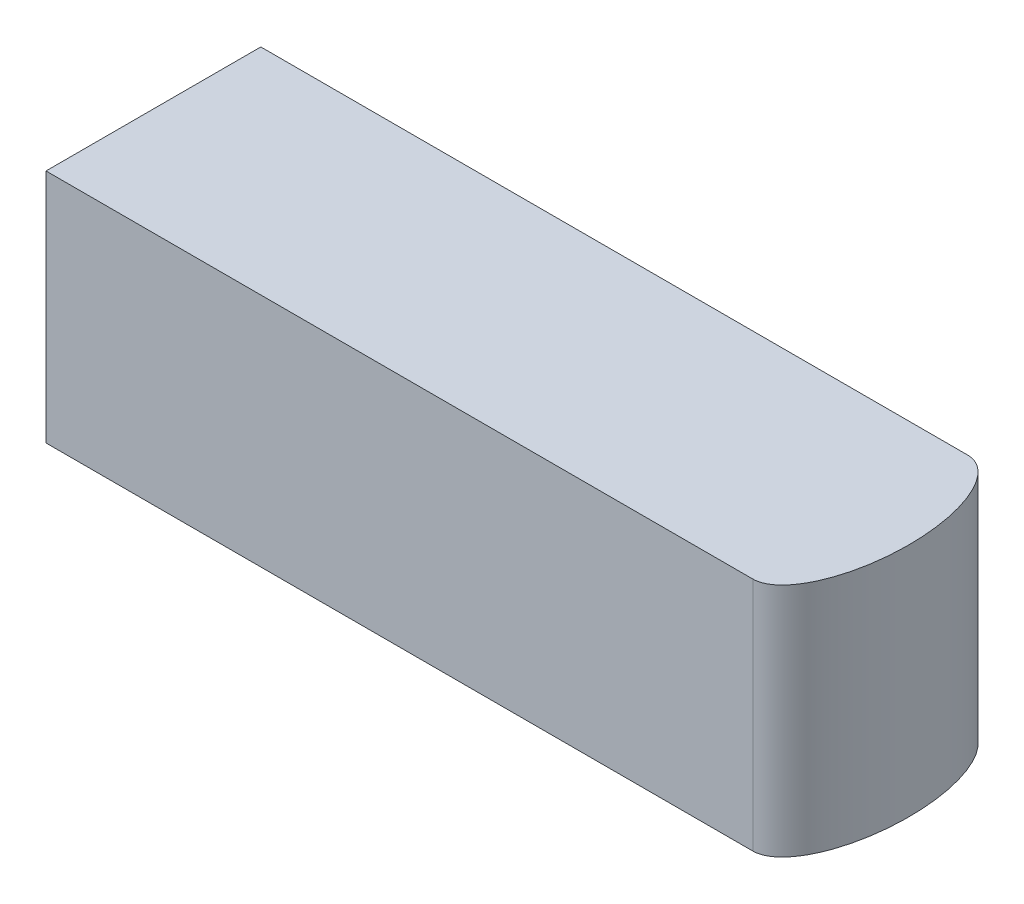
ISO-10303-21;
HEADER;
FILE_DESCRIPTION(('STEP AP214'),'2;1');
FILE_NAME('part.step','',(''),(''),'','','');
FILE_SCHEMA(('AUTOMOTIVE_DESIGN { 1 0 10303 214 1 1 1 1 }'));
ENDSEC;
DATA;
#1=APPLICATION_CONTEXT('core data for automotive mechanical design processes');
#2=APPLICATION_PROTOCOL_DEFINITION('international standard','automotive_design',2000,#1);
#3=PRODUCT_CONTEXT('',#1,'mechanical');
#4=PRODUCT('Part','Part','',(#3));
#5=PRODUCT_RELATED_PRODUCT_CATEGORY('part','',(#4));
#6=PRODUCT_DEFINITION_FORMATION('','',#4);
#7=PRODUCT_DEFINITION_CONTEXT('part definition',#1,'design');
#8=PRODUCT_DEFINITION('design','',#6,#7);
#9=PRODUCT_DEFINITION_SHAPE('','',#8);
#10=(LENGTH_UNIT() NAMED_UNIT(*) SI_UNIT(.MILLI.,.METRE.));
#11=(NAMED_UNIT(*) PLANE_ANGLE_UNIT() SI_UNIT($,.RADIAN.));
#12=(NAMED_UNIT(*) SI_UNIT($,.STERADIAN.) SOLID_ANGLE_UNIT());
#13=UNCERTAINTY_MEASURE_WITH_UNIT(LENGTH_MEASURE(1.E-05),#10,'distance_accuracy_value','');
#14=(GEOMETRIC_REPRESENTATION_CONTEXT(3) GLOBAL_UNCERTAINTY_ASSIGNED_CONTEXT((#13)) GLOBAL_UNIT_ASSIGNED_CONTEXT((#10,
#11,#12)) REPRESENTATION_CONTEXT('',''));
#15=CARTESIAN_POINT('',(0.,0.,0.));
#16=DIRECTION('',(0.,0.,1.));
#17=DIRECTION('',(1.,0.,0.));
#18=AXIS2_PLACEMENT_3D('',#15,#16,#17);
#19=CARTESIAN_POINT('',(51.,34.,0.));
#20=DIRECTION('',(0.,1.,0.));
#21=DIRECTION('',(0.,0.,-1.));
#22=AXIS2_PLACEMENT_3D('',#19,#20,#21);
#23=ELLIPSE('',#22,15.5,7.);
#24=DIRECTION('',(0.,-1.,0.));
#25=VECTOR('',#24,1.);
#26=SURFACE_OF_LINEAR_EXTRUSION('',#23,#25);
#27=CARTESIAN_POINT('',(51.,0.,0.));
#28=DIRECTION('',(0.,1.,0.));
#29=DIRECTION('',(0.,0.,-1.));
#30=AXIS2_PLACEMENT_3D('',#27,#28,#29);
#31=ELLIPSE('',#30,15.5,7.);
#32=CARTESIAN_POINT('',(51.,0.,15.5));
#33=VERTEX_POINT('',#32);
#34=CARTESIAN_POINT('',(51.,0.,-15.5));
#35=VERTEX_POINT('',#34);
#36=EDGE_CURVE('E99',#33,#35,#31,.T.);
#37=ORIENTED_EDGE('',*,*,#36,.T.);
#38=DIRECTION('',(0.,-1.,0.));
#39=VECTOR('',#38,1.);
#40=CARTESIAN_POINT('',(51.,34.,-15.5));
#41=LINE('',#40,#39);
#42=CARTESIAN_POINT('',(51.,34.,-15.5));
#43=VERTEX_POINT('',#42);
#44=EDGE_CURVE('E11',#43,#35,#41,.T.);
#45=ORIENTED_EDGE('',*,*,#44,.F.);
#46=CARTESIAN_POINT('',(51.,34.,15.5));
#47=VERTEX_POINT('',#46);
#48=EDGE_CURVE('E88',#47,#43,#23,.T.);
#49=ORIENTED_EDGE('',*,*,#48,.F.);
#50=DIRECTION('',(0.,-1.,0.));
#51=VECTOR('',#50,1.);
#52=CARTESIAN_POINT('',(51.,34.,15.5));
#53=LINE('',#52,#51);
#54=EDGE_CURVE('E96',#47,#33,#53,.T.);
#55=ORIENTED_EDGE('',*,*,#54,.T.);
#56=EDGE_LOOP('',(#37,#45,#49,#55));
#57=FACE_BOUND('',#56,.T.);
#58=ADVANCED_FACE('F36',(#57),#26,.F.);
#59=CARTESIAN_POINT('',(-51.,34.,-15.5));
#60=DIRECTION('',(0.,0.,1.));
#61=DIRECTION('',(1.,0.,0.));
#62=AXIS2_PLACEMENT_3D('',#59,#60,#61);
#63=PLANE('',#62);
#64=DIRECTION('',(-1.,0.,0.));
#65=VECTOR('',#64,1.);
#66=CARTESIAN_POINT('',(-51.,0.,-15.5));
#67=LINE('',#66,#65);
#68=CARTESIAN_POINT('',(-51.,0.,-15.5));
#69=VERTEX_POINT('',#68);
#70=EDGE_CURVE('E92',#35,#69,#67,.T.);
#71=ORIENTED_EDGE('',*,*,#70,.T.);
#72=DIRECTION('',(0.,-1.,0.));
#73=VECTOR('',#72,1.);
#74=CARTESIAN_POINT('',(-51.,34.,-15.5));
#75=LINE('',#74,#73);
#76=CARTESIAN_POINT('',(-51.,34.,-15.5));
#77=VERTEX_POINT('',#76);
#78=EDGE_CURVE('E45',#77,#69,#75,.T.);
#79=ORIENTED_EDGE('',*,*,#78,.F.);
#80=DIRECTION('',(-1.,0.,0.));
#81=VECTOR('',#80,1.);
#82=CARTESIAN_POINT('',(-51.,34.,-15.5));
#83=LINE('',#82,#81);
#84=EDGE_CURVE('E83',#43,#77,#83,.T.);
#85=ORIENTED_EDGE('',*,*,#84,.F.);
#86=ORIENTED_EDGE('',*,*,#44,.T.);
#87=EDGE_LOOP('',(#71,#79,#85,#86));
#88=FACE_BOUND('',#87,.T.);
#89=ADVANCED_FACE('F91',(#88),#63,.F.);
#90=CARTESIAN_POINT('',(-51.,34.,15.5));
#91=DIRECTION('',(1.,0.,0.));
#92=DIRECTION('',(0.,0.,-1.));
#93=AXIS2_PLACEMENT_3D('',#90,#91,#92);
#94=PLANE('',#93);
#95=DIRECTION('',(0.,0.,1.));
#96=VECTOR('',#95,1.);
#97=CARTESIAN_POINT('',(-51.,0.,15.5));
#98=LINE('',#97,#96);
#99=CARTESIAN_POINT('',(-51.,0.,15.5));
#100=VERTEX_POINT('',#99);
#101=EDGE_CURVE('E70',#69,#100,#98,.T.);
#102=ORIENTED_EDGE('',*,*,#101,.T.);
#103=DIRECTION('',(0.,-1.,0.));
#104=VECTOR('',#103,1.);
#105=CARTESIAN_POINT('',(-51.,34.,15.5));
#106=LINE('',#105,#104);
#107=CARTESIAN_POINT('',(-51.,34.,15.5));
#108=VERTEX_POINT('',#107);
#109=EDGE_CURVE('E93',#108,#100,#106,.T.);
#110=ORIENTED_EDGE('',*,*,#109,.F.);
#111=DIRECTION('',(0.,0.,1.));
#112=VECTOR('',#111,1.);
#113=CARTESIAN_POINT('',(-51.,34.,15.5));
#114=LINE('',#113,#112);
#115=EDGE_CURVE('E86',#77,#108,#114,.T.);
#116=ORIENTED_EDGE('',*,*,#115,.F.);
#117=ORIENTED_EDGE('',*,*,#78,.T.);
#118=EDGE_LOOP('',(#102,#110,#116,#117));
#119=FACE_BOUND('',#118,.T.);
#120=ADVANCED_FACE('F94',(#119),#94,.F.);
#121=CARTESIAN_POINT('',(-51.,34.,15.5));
#122=DIRECTION('',(0.,0.,-1.));
#123=DIRECTION('',(-1.,0.,0.));
#124=AXIS2_PLACEMENT_3D('',#121,#122,#123);
#125=PLANE('',#124);
#126=DIRECTION('',(1.,0.,0.));
#127=VECTOR('',#126,1.);
#128=CARTESIAN_POINT('',(-51.,0.,15.5));
#129=LINE('',#128,#127);
#130=EDGE_CURVE('E76',#100,#33,#129,.T.);
#131=ORIENTED_EDGE('',*,*,#130,.T.);
#132=ORIENTED_EDGE('',*,*,#54,.F.);
#133=DIRECTION('',(1.,0.,0.));
#134=VECTOR('',#133,1.);
#135=CARTESIAN_POINT('',(-51.,34.,15.5));
#136=LINE('',#135,#134);
#137=EDGE_CURVE('E53',#108,#47,#136,.T.);
#138=ORIENTED_EDGE('',*,*,#137,.F.);
#139=ORIENTED_EDGE('',*,*,#109,.T.);
#140=EDGE_LOOP('',(#131,#132,#138,#139));
#141=FACE_BOUND('',#140,.T.);
#142=ADVANCED_FACE('F106',(#141),#125,.F.);
#143=CARTESIAN_POINT('',(51.,34.,0.));
#144=DIRECTION('',(0.,-1.,0.));
#145=DIRECTION('',(0.,0.,-1.));
#146=AXIS2_PLACEMENT_3D('',#143,#144,#145);
#147=PLANE('',#146);
#148=ORIENTED_EDGE('',*,*,#48,.T.);
#149=ORIENTED_EDGE('',*,*,#84,.T.);
#150=ORIENTED_EDGE('',*,*,#115,.T.);
#151=ORIENTED_EDGE('',*,*,#137,.T.);
#152=EDGE_LOOP('',(#148,#149,#150,#151));
#153=FACE_BOUND('',#152,.T.);
#154=ADVANCED_FACE('F84',(#153),#147,.F.);
#155=CARTESIAN_POINT('',(51.,0.,0.));
#156=DIRECTION('',(0.,-1.,0.));
#157=DIRECTION('',(0.,0.,-1.));
#158=AXIS2_PLACEMENT_3D('',#155,#156,#157);
#159=PLANE('',#158);
#160=ORIENTED_EDGE('',*,*,#36,.F.);
#161=ORIENTED_EDGE('',*,*,#130,.F.);
#162=ORIENTED_EDGE('',*,*,#101,.F.);
#163=ORIENTED_EDGE('',*,*,#70,.F.);
#164=EDGE_LOOP('',(#160,#161,#162,#163));
#165=FACE_BOUND('',#164,.T.);
#166=ADVANCED_FACE('F109',(#165),#159,.T.);
#167=CLOSED_SHELL('',(#58,#89,#120,#142,#154,#166));
#168=MANIFOLD_SOLID_BREP('B2',#167);
#169=ADVANCED_BREP_SHAPE_REPRESENTATION('',(#18,#168),#14);
#170=SHAPE_DEFINITION_REPRESENTATION(#9,#169);
ENDSEC;
END-ISO-10303-21;
